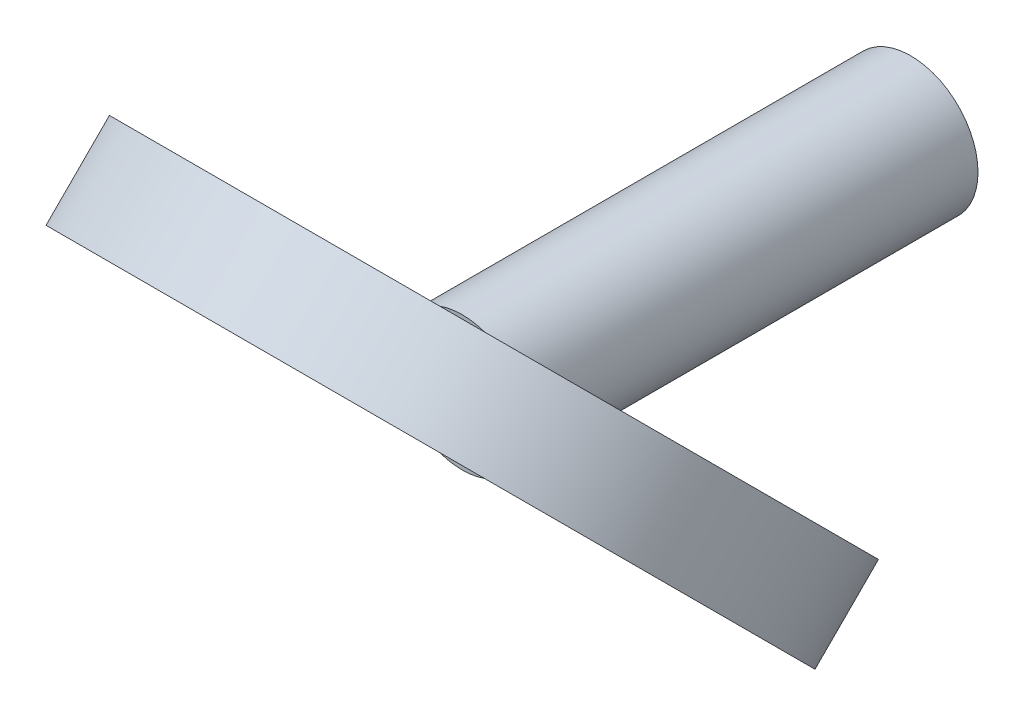
ISO-10303-21;
HEADER;
FILE_DESCRIPTION(('STEP AP214'),'2;1');
FILE_NAME('part.step','',(''),(''),'','','');
FILE_SCHEMA(('AUTOMOTIVE_DESIGN { 1 0 10303 214 1 1 1 1 }'));
ENDSEC;
DATA;
#1=APPLICATION_CONTEXT('core data for automotive mechanical design processes');
#2=APPLICATION_PROTOCOL_DEFINITION('international standard','automotive_design',2000,#1);
#3=PRODUCT_CONTEXT('',#1,'mechanical');
#4=PRODUCT('Part','Part','',(#3));
#5=PRODUCT_RELATED_PRODUCT_CATEGORY('part','',(#4));
#6=PRODUCT_DEFINITION_FORMATION('','',#4);
#7=PRODUCT_DEFINITION_CONTEXT('part definition',#1,'design');
#8=PRODUCT_DEFINITION('design','',#6,#7);
#9=PRODUCT_DEFINITION_SHAPE('','',#8);
#10=(LENGTH_UNIT() NAMED_UNIT(*) SI_UNIT(.MILLI.,.METRE.));
#11=(NAMED_UNIT(*) PLANE_ANGLE_UNIT() SI_UNIT($,.RADIAN.));
#12=(NAMED_UNIT(*) SI_UNIT($,.STERADIAN.) SOLID_ANGLE_UNIT());
#13=UNCERTAINTY_MEASURE_WITH_UNIT(LENGTH_MEASURE(1.E-05),#10,'distance_accuracy_value','');
#14=(GEOMETRIC_REPRESENTATION_CONTEXT(3) GLOBAL_UNCERTAINTY_ASSIGNED_CONTEXT((#13)) GLOBAL_UNIT_ASSIGNED_CONTEXT((#10,
#11,#12)) REPRESENTATION_CONTEXT('',''));
#15=CARTESIAN_POINT('',(0.,0.,0.));
#16=DIRECTION('',(0.,0.,1.));
#17=DIRECTION('',(1.,0.,0.));
#18=AXIS2_PLACEMENT_3D('',#15,#16,#17);
#19=CARTESIAN_POINT('',(0.,0.,-50.));
#20=DIRECTION('',(0.,0.,1.));
#21=DIRECTION('',(1.,0.,0.));
#22=AXIS2_PLACEMENT_3D('',#19,#20,#21);
#23=CYLINDRICAL_SURFACE('',#22,7.5);
#24=CARTESIAN_POINT('',(0.,0.,-50.));
#25=DIRECTION('',(0.,0.,1.));
#26=DIRECTION('',(1.,0.,0.));
#27=AXIS2_PLACEMENT_3D('',#24,#25,#26);
#28=CIRCLE('',#27,7.5);
#29=CARTESIAN_POINT('',(7.5,0.,-50.));
#30=VERTEX_POINT('',#29);
#31=EDGE_CURVE('E62',#30,#30,#28,.T.);
#32=ORIENTED_EDGE('',*,*,#31,.T.);
#33=EDGE_LOOP('',(#32));
#34=FACE_BOUND('',#33,.T.);
#35=CARTESIAN_POINT('',(0.,0.,0.));
#36=DIRECTION('',(0.,0.,1.));
#37=DIRECTION('',(1.,0.,0.));
#38=AXIS2_PLACEMENT_3D('',#35,#36,#37);
#39=CIRCLE('',#38,7.5);
#40=CARTESIAN_POINT('',(2.5,7.07106781186548,0.));
#41=VERTEX_POINT('',#40);
#42=CARTESIAN_POINT('',(-2.5,7.07106781186548,0.));
#43=VERTEX_POINT('',#42);
#44=EDGE_CURVE('E64',#41,#43,#39,.T.);
#45=ORIENTED_EDGE('',*,*,#44,.F.);
#46=CARTESIAN_POINT('',(0.,0.,-7.07106781186547));
#47=DIRECTION('',(0.,-0.707106781186547,0.707106781186548));
#48=DIRECTION('',(0.,0.707106781186548,0.707106781186547));
#49=AXIS2_PLACEMENT_3D('',#46,#47,#48);
#50=ELLIPSE('',#49,10.6066017177982,7.5);
#51=EDGE_CURVE('E52',#41,#43,#50,.F.);
#52=ORIENTED_EDGE('',*,*,#51,.T.);
#53=EDGE_LOOP('',(#45,#52));
#54=FACE_BOUND('',#53,.T.);
#55=ADVANCED_FACE('F33',(#34,#54),#23,.T.);
#56=CARTESIAN_POINT('',(0.,0.,0.));
#57=DIRECTION('',(0.,0.,1.));
#58=DIRECTION('',(1.,0.,0.));
#59=AXIS2_PLACEMENT_3D('',#56,#57,#58);
#60=PLANE('',#59);
#61=ORIENTED_EDGE('',*,*,#44,.T.);
#62=DIRECTION('',(1.,0.,0.));
#63=VECTOR('',#62,1.);
#64=CARTESIAN_POINT('',(0.,7.07106781186548,0.));
#65=LINE('',#64,#63);
#66=EDGE_CURVE('E41',#43,#41,#65,.T.);
#67=ORIENTED_EDGE('',*,*,#66,.T.);
#68=EDGE_LOOP('',(#61,#67));
#69=FACE_BOUND('',#68,.T.);
#70=ADVANCED_FACE('F68',(#69),#60,.T.);
#71=CARTESIAN_POINT('',(0.,0.,-50.));
#72=DIRECTION('',(0.,0.,1.));
#73=DIRECTION('',(1.,0.,0.));
#74=AXIS2_PLACEMENT_3D('',#71,#72,#73);
#75=PLANE('',#74);
#76=CARTESIAN_POINT('',(0.,0.,-50.));
#77=DIRECTION('',(0.,0.,-1.));
#78=DIRECTION('',(-1.,0.,0.));
#79=AXIS2_PLACEMENT_3D('',#76,#77,#78);
#80=CIRCLE('',#79,2.5);
#81=CARTESIAN_POINT('',(-2.5,0.,-50.));
#82=VERTEX_POINT('',#81);
#83=EDGE_CURVE('E82',#82,#82,#80,.T.);
#84=ORIENTED_EDGE('',*,*,#83,.F.);
#85=EDGE_LOOP('',(#84));
#86=FACE_BOUND('',#85,.T.);
#87=ORIENTED_EDGE('',*,*,#31,.F.);
#88=EDGE_LOOP('',(#87));
#89=FACE_BOUND('',#88,.T.);
#90=ADVANCED_FACE('F96',(#86,#89),#75,.F.);
#91=CARTESIAN_POINT('',(0.,-3.53553390593274,3.53553390593274));
#92=DIRECTION('',(0.,0.707106781186547,-0.707106781186548));
#93=DIRECTION('',(0.,0.707106781186548,0.707106781186547));
#94=AXIS2_PLACEMENT_3D('',#91,#92,#93);
#95=CYLINDRICAL_SURFACE('',#94,35.);
#96=CARTESIAN_POINT('',(0.,-3.53553390593274,3.53553390593274));
#97=DIRECTION('',(0.,-0.707106781186547,0.707106781186548));
#98=DIRECTION('',(0.,-0.707106781186548,-0.707106781186547));
#99=AXIS2_PLACEMENT_3D('',#96,#97,#98);
#100=CIRCLE('',#99,35.);
#101=CARTESIAN_POINT('',(0.,-28.2842712474619,-21.2132034355964));
#102=VERTEX_POINT('',#101);
#103=EDGE_CURVE('E66',#102,#102,#100,.T.);
#104=ORIENTED_EDGE('',*,*,#103,.F.);
#105=EDGE_LOOP('',(#104));
#106=FACE_BOUND('',#105,.T.);
#107=CARTESIAN_POINT('',(0.,3.53553390593274,-3.53553390593274));
#108=DIRECTION('',(0.,-0.707106781186547,0.707106781186548));
#109=DIRECTION('',(0.,-0.707106781186548,-0.707106781186547));
#110=AXIS2_PLACEMENT_3D('',#107,#108,#109);
#111=CIRCLE('',#110,35.);
#112=CARTESIAN_POINT('',(0.,-21.2132034355964,-28.2842712474619));
#113=VERTEX_POINT('',#112);
#114=EDGE_CURVE('E76',#113,#113,#111,.T.);
#115=ORIENTED_EDGE('',*,*,#114,.T.);
#116=EDGE_LOOP('',(#115));
#117=FACE_BOUND('',#116,.T.);
#118=ADVANCED_FACE('F99',(#106,#117),#95,.T.);
#119=CARTESIAN_POINT('',(0.,-3.53553390593274,3.53553390593274));
#120=DIRECTION('',(0.,-0.707106781186547,0.707106781186548));
#121=DIRECTION('',(0.,-0.707106781186548,-0.707106781186547));
#122=AXIS2_PLACEMENT_3D('',#119,#120,#121);
#123=PLANE('',#122);
#124=DIRECTION('',(1.,0.,0.));
#125=VECTOR('',#124,1.);
#126=CARTESIAN_POINT('',(0.,-7.07106781186548,0.));
#127=LINE('',#126,#125);
#128=CARTESIAN_POINT('',(-2.5,-7.07106781186548,0.));
#129=VERTEX_POINT('',#128);
#130=CARTESIAN_POINT('',(2.5,-7.07106781186548,0.));
#131=VERTEX_POINT('',#130);
#132=EDGE_CURVE('E11',#129,#131,#127,.T.);
#133=ORIENTED_EDGE('',*,*,#132,.T.);
#134=CARTESIAN_POINT('',(0.,0.,7.07106781186548));
#135=DIRECTION('',(0.,-0.707106781186547,0.707106781186548));
#136=DIRECTION('',(0.,0.707106781186548,0.707106781186547));
#137=AXIS2_PLACEMENT_3D('',#134,#135,#136);
#138=ELLIPSE('',#137,10.6066017177982,7.5);
#139=EDGE_CURVE('E65',#131,#129,#138,.F.);
#140=ORIENTED_EDGE('',*,*,#139,.T.);
#141=EDGE_LOOP('',(#133,#140));
#142=FACE_BOUND('',#141,.T.);
#143=ORIENTED_EDGE('',*,*,#103,.T.);
#144=EDGE_LOOP('',(#143));
#145=FACE_BOUND('',#144,.T.);
#146=ADVANCED_FACE('F115',(#142,#145),#123,.T.);
#147=CARTESIAN_POINT('',(0.,3.53553390593274,-3.53553390593274));
#148=DIRECTION('',(0.,-0.707106781186547,0.707106781186548));
#149=DIRECTION('',(0.,-0.707106781186548,-0.707106781186547));
#150=AXIS2_PLACEMENT_3D('',#147,#148,#149);
#151=PLANE('',#150);
#152=ORIENTED_EDGE('',*,*,#51,.F.);
#153=ORIENTED_EDGE('',*,*,#66,.F.);
#154=EDGE_LOOP('',(#152,#153));
#155=FACE_BOUND('',#154,.T.);
#156=ORIENTED_EDGE('',*,*,#114,.F.);
#157=EDGE_LOOP('',(#156));
#158=FACE_BOUND('',#157,.T.);
#159=ADVANCED_FACE('F57',(#155,#158),#151,.F.);
#160=ORIENTED_EDGE('',*,*,#132,.F.);
#161=EDGE_CURVE('E69',#129,#131,#39,.T.);
#162=ORIENTED_EDGE('',*,*,#161,.T.);
#163=EDGE_LOOP('',(#160,#162));
#164=FACE_BOUND('',#163,.T.);
#165=ADVANCED_FACE('F107',(#164),#60,.T.);
#166=ORIENTED_EDGE('',*,*,#139,.F.);
#167=ORIENTED_EDGE('',*,*,#161,.F.);
#168=EDGE_LOOP('',(#166,#167));
#169=FACE_BOUND('',#168,.T.);
#170=ADVANCED_FACE('F35',(#169),#23,.T.);
#171=CARTESIAN_POINT('',(0.,0.,-45.));
#172=DIRECTION('',(0.,0.,-1.));
#173=DIRECTION('',(-1.,0.,0.));
#174=AXIS2_PLACEMENT_3D('',#171,#172,#173);
#175=CYLINDRICAL_SURFACE('',#174,2.5);
#176=CARTESIAN_POINT('',(0.,0.,-45.));
#177=DIRECTION('',(0.,0.,-1.));
#178=DIRECTION('',(-1.,0.,0.));
#179=AXIS2_PLACEMENT_3D('',#176,#177,#178);
#180=CIRCLE('',#179,2.5);
#181=CARTESIAN_POINT('',(-2.5,0.,-45.));
#182=VERTEX_POINT('',#181);
#183=EDGE_CURVE('E79',#182,#182,#180,.T.);
#184=ORIENTED_EDGE('',*,*,#183,.F.);
#185=EDGE_LOOP('',(#184));
#186=FACE_BOUND('',#185,.T.);
#187=ORIENTED_EDGE('',*,*,#83,.T.);
#188=EDGE_LOOP('',(#187));
#189=FACE_BOUND('',#188,.T.);
#190=ADVANCED_FACE('F90',(#186,#189),#175,.F.);
#191=CARTESIAN_POINT('',(0.,0.,-45.));
#192=DIRECTION('',(0.,0.,-1.));
#193=DIRECTION('',(-1.,0.,0.));
#194=AXIS2_PLACEMENT_3D('',#191,#192,#193);
#195=PLANE('',#194);
#196=ORIENTED_EDGE('',*,*,#183,.T.);
#197=EDGE_LOOP('',(#196));
#198=FACE_BOUND('',#197,.T.);
#199=ADVANCED_FACE('F88',(#198),#195,.T.);
#200=CLOSED_SHELL('',(#55,#70,#90,#118,#146,#159,#165,#170,#190,#199));
#201=MANIFOLD_SOLID_BREP('B2',#200);
#202=ADVANCED_BREP_SHAPE_REPRESENTATION('',(#18,#201),#14);
#203=SHAPE_DEFINITION_REPRESENTATION(#9,#202);
ENDSEC;
END-ISO-10303-21;
